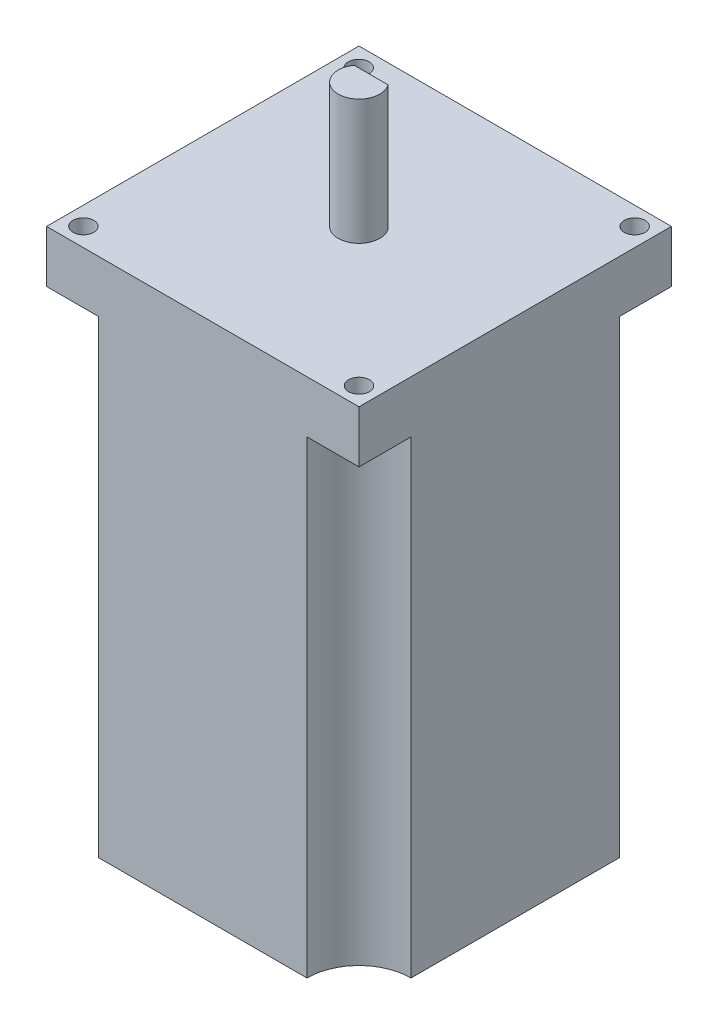
ISO-10303-21;
HEADER;
FILE_DESCRIPTION(('STEP AP214'),'2;1');
FILE_NAME('part.step','',(''),(''),'','','');
FILE_SCHEMA(('AUTOMOTIVE_DESIGN { 1 0 10303 214 1 1 1 1 }'));
ENDSEC;
DATA;
#1=APPLICATION_CONTEXT('core data for automotive mechanical design processes');
#2=APPLICATION_PROTOCOL_DEFINITION('international standard','automotive_design',2000,#1);
#3=PRODUCT_CONTEXT('',#1,'mechanical');
#4=PRODUCT('Part','Part','',(#3));
#5=PRODUCT_RELATED_PRODUCT_CATEGORY('part','',(#4));
#6=PRODUCT_DEFINITION_FORMATION('','',#4);
#7=PRODUCT_DEFINITION_CONTEXT('part definition',#1,'design');
#8=PRODUCT_DEFINITION('design','',#6,#7);
#9=PRODUCT_DEFINITION_SHAPE('','',#8);
#10=(LENGTH_UNIT() NAMED_UNIT(*) SI_UNIT(.MILLI.,.METRE.));
#11=(NAMED_UNIT(*) PLANE_ANGLE_UNIT() SI_UNIT($,.RADIAN.));
#12=(NAMED_UNIT(*) SI_UNIT($,.STERADIAN.) SOLID_ANGLE_UNIT());
#13=UNCERTAINTY_MEASURE_WITH_UNIT(LENGTH_MEASURE(1.E-05),#10,'distance_accuracy_value','');
#14=(GEOMETRIC_REPRESENTATION_CONTEXT(3) GLOBAL_UNCERTAINTY_ASSIGNED_CONTEXT((#13)) GLOBAL_UNIT_ASSIGNED_CONTEXT((#10,
#11,#12)) REPRESENTATION_CONTEXT('',''));
#15=CARTESIAN_POINT('',(0.,0.,0.));
#16=DIRECTION('',(0.,0.,1.));
#17=DIRECTION('',(1.,0.,0.));
#18=AXIS2_PLACEMENT_3D('',#15,#16,#17);
#19=CARTESIAN_POINT('',(0.,100.,0.));
#20=DIRECTION('',(0.,1.,0.));
#21=DIRECTION('',(0.,0.,1.));
#22=AXIS2_PLACEMENT_3D('',#19,#20,#21);
#23=PLANE('',#22);
#24=CARTESIAN_POINT('',(26.4644660940673,100.,-26.4644660940673));
#25=DIRECTION('',(0.,1.,0.));
#26=DIRECTION('',(0.,0.,1.));
#27=AXIS2_PLACEMENT_3D('',#24,#25,#26);
#28=CIRCLE('',#27,2.);
#29=CARTESIAN_POINT('',(26.4644660940673,100.,-24.4644660940673));
#30=VERTEX_POINT('',#29);
#31=EDGE_CURVE('E284',#30,#30,#28,.F.);
#32=ORIENTED_EDGE('',*,*,#31,.T.);
#33=EDGE_LOOP('',(#32));
#34=FACE_BOUND('',#33,.T.);
#35=CARTESIAN_POINT('',(26.4969134548636,100.,26.4969134548636));
#36=DIRECTION('',(0.,1.,0.));
#37=DIRECTION('',(0.,0.,1.));
#38=AXIS2_PLACEMENT_3D('',#35,#36,#37);
#39=CIRCLE('',#38,2.);
#40=CARTESIAN_POINT('',(26.4969134548636,100.,28.4969134548636));
#41=VERTEX_POINT('',#40);
#42=EDGE_CURVE('E278',#41,#41,#39,.F.);
#43=ORIENTED_EDGE('',*,*,#42,.T.);
#44=EDGE_LOOP('',(#43));
#45=FACE_BOUND('',#44,.T.);
#46=CARTESIAN_POINT('',(-26.4734771597201,100.,26.4554779367333));
#47=DIRECTION('',(0.,1.,0.));
#48=DIRECTION('',(0.,0.,1.));
#49=AXIS2_PLACEMENT_3D('',#46,#47,#48);
#50=CIRCLE('',#49,2.);
#51=CARTESIAN_POINT('',(-26.4734771597201,100.,28.4554779367333));
#52=VERTEX_POINT('',#51);
#53=EDGE_CURVE('E272',#52,#52,#50,.F.);
#54=ORIENTED_EDGE('',*,*,#53,.T.);
#55=EDGE_LOOP('',(#54));
#56=FACE_BOUND('',#55,.T.);
#57=CARTESIAN_POINT('',(-26.4080798581669,100.,-26.3523969664421));
#58=DIRECTION('',(0.,1.,0.));
#59=DIRECTION('',(0.,0.,1.));
#60=AXIS2_PLACEMENT_3D('',#57,#58,#59);
#61=CIRCLE('',#60,2.);
#62=CARTESIAN_POINT('',(-26.4080798581669,100.,-24.3523969664421));
#63=VERTEX_POINT('',#62);
#64=EDGE_CURVE('E266',#63,#63,#61,.F.);
#65=ORIENTED_EDGE('',*,*,#64,.T.);
#66=EDGE_LOOP('',(#65));
#67=FACE_BOUND('',#66,.T.);
#68=DIRECTION('',(0.,0.,-1.));
#69=VECTOR('',#68,1.);
#70=CARTESIAN_POINT('',(30.,100.,-30.));
#71=LINE('',#70,#69);
#72=CARTESIAN_POINT('',(30.,100.,30.));
#73=VERTEX_POINT('',#72);
#74=CARTESIAN_POINT('',(30.,100.,-30.));
#75=VERTEX_POINT('',#74);
#76=EDGE_CURVE('E143',#73,#75,#71,.T.);
#77=ORIENTED_EDGE('',*,*,#76,.T.);
#78=DIRECTION('',(-1.,0.,0.));
#79=VECTOR('',#78,1.);
#80=CARTESIAN_POINT('',(-30.,100.,-30.));
#81=LINE('',#80,#79);
#82=CARTESIAN_POINT('',(-30.,100.,-30.));
#83=VERTEX_POINT('',#82);
#84=EDGE_CURVE('E147',#75,#83,#81,.T.);
#85=ORIENTED_EDGE('',*,*,#84,.T.);
#86=DIRECTION('',(0.,0.,1.));
#87=VECTOR('',#86,1.);
#88=CARTESIAN_POINT('',(-30.,100.,-30.));
#89=LINE('',#88,#87);
#90=CARTESIAN_POINT('',(-30.,100.,30.));
#91=VERTEX_POINT('',#90);
#92=EDGE_CURVE('E248',#83,#91,#89,.T.);
#93=ORIENTED_EDGE('',*,*,#92,.T.);
#94=DIRECTION('',(1.,0.,0.));
#95=VECTOR('',#94,1.);
#96=CARTESIAN_POINT('',(-30.,100.,30.));
#97=LINE('',#96,#95);
#98=EDGE_CURVE('E167',#91,#73,#97,.T.);
#99=ORIENTED_EDGE('',*,*,#98,.T.);
#100=EDGE_LOOP('',(#77,#85,#93,#99));
#101=FACE_BOUND('',#100,.T.);
#102=DIRECTION('',(-1.,0.,0.));
#103=VECTOR('',#102,1.);
#104=CARTESIAN_POINT('',(-3.25,100.,-2.3318447632722));
#105=LINE('',#104,#103);
#106=CARTESIAN_POINT('',(3.25,100.,-2.3318447632722));
#107=VERTEX_POINT('',#106);
#108=CARTESIAN_POINT('',(-3.25,100.,-2.3318447632722));
#109=VERTEX_POINT('',#108);
#110=EDGE_CURVE('E256',#107,#109,#105,.T.);
#111=ORIENTED_EDGE('',*,*,#110,.F.);
#112=CARTESIAN_POINT('',(0.,100.,0.));
#113=DIRECTION('',(0.,1.,0.));
#114=DIRECTION('',(0.,0.,1.));
#115=AXIS2_PLACEMENT_3D('',#112,#113,#114);
#116=CIRCLE('',#115,4.);
#117=EDGE_CURVE('E52',#109,#107,#116,.T.);
#118=ORIENTED_EDGE('',*,*,#117,.F.);
#119=EDGE_LOOP('',(#111,#118));
#120=FACE_BOUND('',#119,.T.);
#121=ADVANCED_FACE('F35',(#34,#45,#56,#67,#101,#120),#23,.T.);
#122=CARTESIAN_POINT('',(30.,90.,-30.));
#123=DIRECTION('',(0.,-1.,0.));
#124=DIRECTION('',(0.,0.,-1.));
#125=AXIS2_PLACEMENT_3D('',#122,#123,#124);
#126=CYLINDRICAL_SURFACE('',#125,10.);
#127=CARTESIAN_POINT('',(30.,0.,-30.));
#128=DIRECTION('',(0.,-1.,0.));
#129=DIRECTION('',(0.,0.,1.));
#130=AXIS2_PLACEMENT_3D('',#127,#128,#129);
#131=CIRCLE('',#130,10.);
#132=CARTESIAN_POINT('',(30.,0.,-20.));
#133=VERTEX_POINT('',#132);
#134=CARTESIAN_POINT('',(20.,0.,-30.));
#135=VERTEX_POINT('',#134);
#136=EDGE_CURVE('E174',#133,#135,#131,.T.);
#137=ORIENTED_EDGE('',*,*,#136,.T.);
#138=DIRECTION('',(0.,-1.,0.));
#139=VECTOR('',#138,1.);
#140=CARTESIAN_POINT('',(20.,90.,-30.));
#141=LINE('',#140,#139);
#142=CARTESIAN_POINT('',(20.,90.,-30.));
#143=VERTEX_POINT('',#142);
#144=EDGE_CURVE('E11',#143,#135,#141,.T.);
#145=ORIENTED_EDGE('',*,*,#144,.F.);
#146=CARTESIAN_POINT('',(30.,90.,-30.));
#147=DIRECTION('',(0.,-1.,0.));
#148=DIRECTION('',(0.,0.,1.));
#149=AXIS2_PLACEMENT_3D('',#146,#147,#148);
#150=CIRCLE('',#149,10.);
#151=CARTESIAN_POINT('',(30.,90.,-20.));
#152=VERTEX_POINT('',#151);
#153=EDGE_CURVE('E299',#152,#143,#150,.T.);
#154=ORIENTED_EDGE('',*,*,#153,.F.);
#155=DIRECTION('',(0.,-1.,0.));
#156=VECTOR('',#155,1.);
#157=CARTESIAN_POINT('',(30.,90.,-20.));
#158=LINE('',#157,#156);
#159=EDGE_CURVE('E61',#152,#133,#158,.T.);
#160=ORIENTED_EDGE('',*,*,#159,.T.);
#161=EDGE_LOOP('',(#137,#145,#154,#160));
#162=FACE_BOUND('',#161,.T.);
#163=ADVANCED_FACE('F37',(#162),#126,.F.);
#164=CARTESIAN_POINT('',(-20.,90.,-30.));
#165=DIRECTION('',(0.,0.,1.));
#166=DIRECTION('',(1.,0.,0.));
#167=AXIS2_PLACEMENT_3D('',#164,#165,#166);
#168=PLANE('',#167);
#169=DIRECTION('',(-1.,0.,0.));
#170=VECTOR('',#169,1.);
#171=CARTESIAN_POINT('',(-20.,0.,-30.));
#172=LINE('',#171,#170);
#173=CARTESIAN_POINT('',(-20.,0.,-30.));
#174=VERTEX_POINT('',#173);
#175=EDGE_CURVE('E301',#135,#174,#172,.T.);
#176=ORIENTED_EDGE('',*,*,#175,.T.);
#177=DIRECTION('',(0.,-1.,0.));
#178=VECTOR('',#177,1.);
#179=CARTESIAN_POINT('',(-20.,90.,-30.));
#180=LINE('',#179,#178);
#181=CARTESIAN_POINT('',(-20.,90.,-30.));
#182=VERTEX_POINT('',#181);
#183=EDGE_CURVE('E44',#182,#174,#180,.T.);
#184=ORIENTED_EDGE('',*,*,#183,.F.);
#185=DIRECTION('',(-1.,0.,0.));
#186=VECTOR('',#185,1.);
#187=CARTESIAN_POINT('',(-30.,90.,-30.));
#188=LINE('',#187,#186);
#189=CARTESIAN_POINT('',(-30.,90.,-30.));
#190=VERTEX_POINT('',#189);
#191=EDGE_CURVE('E177',#182,#190,#188,.T.);
#192=ORIENTED_EDGE('',*,*,#191,.T.);
#193=DIRECTION('',(0.,-1.,0.));
#194=VECTOR('',#193,1.);
#195=CARTESIAN_POINT('',(-30.,100.,-30.));
#196=LINE('',#195,#194);
#197=EDGE_CURVE('E169',#83,#190,#196,.T.);
#198=ORIENTED_EDGE('',*,*,#197,.F.);
#199=ORIENTED_EDGE('',*,*,#84,.F.);
#200=DIRECTION('',(0.,-1.,0.));
#201=VECTOR('',#200,1.);
#202=CARTESIAN_POINT('',(30.,100.,-30.));
#203=LINE('',#202,#201);
#204=CARTESIAN_POINT('',(30.,90.,-30.));
#205=VERTEX_POINT('',#204);
#206=EDGE_CURVE('E172',#75,#205,#203,.T.);
#207=ORIENTED_EDGE('',*,*,#206,.T.);
#208=EDGE_CURVE('E187',#205,#143,#188,.T.);
#209=ORIENTED_EDGE('',*,*,#208,.T.);
#210=ORIENTED_EDGE('',*,*,#144,.T.);
#211=EDGE_LOOP('',(#176,#184,#192,#198,#199,#207,#209,#210));
#212=FACE_BOUND('',#211,.T.);
#213=ADVANCED_FACE('F300',(#212),#168,.F.);
#214=CARTESIAN_POINT('',(-30.,90.,-30.));
#215=DIRECTION('',(0.,-1.,0.));
#216=DIRECTION('',(0.,0.,-1.));
#217=AXIS2_PLACEMENT_3D('',#214,#215,#216);
#218=CYLINDRICAL_SURFACE('',#217,10.);
#219=CARTESIAN_POINT('',(-30.,0.,-30.));
#220=DIRECTION('',(0.,-1.,0.));
#221=DIRECTION('',(0.,0.,1.));
#222=AXIS2_PLACEMENT_3D('',#219,#220,#221);
#223=CIRCLE('',#222,10.);
#224=CARTESIAN_POINT('',(-30.,0.,-20.));
#225=VERTEX_POINT('',#224);
#226=EDGE_CURVE('E306',#174,#225,#223,.T.);
#227=ORIENTED_EDGE('',*,*,#226,.T.);
#228=DIRECTION('',(0.,-1.,0.));
#229=VECTOR('',#228,1.);
#230=CARTESIAN_POINT('',(-30.,90.,-20.));
#231=LINE('',#230,#229);
#232=CARTESIAN_POINT('',(-30.,90.,-20.));
#233=VERTEX_POINT('',#232);
#234=EDGE_CURVE('E195',#233,#225,#231,.T.);
#235=ORIENTED_EDGE('',*,*,#234,.F.);
#236=CARTESIAN_POINT('',(-30.,90.,-30.));
#237=DIRECTION('',(0.,-1.,0.));
#238=DIRECTION('',(0.,0.,1.));
#239=AXIS2_PLACEMENT_3D('',#236,#237,#238);
#240=CIRCLE('',#239,10.);
#241=EDGE_CURVE('E136',#182,#233,#240,.T.);
#242=ORIENTED_EDGE('',*,*,#241,.F.);
#243=ORIENTED_EDGE('',*,*,#183,.T.);
#244=EDGE_LOOP('',(#227,#235,#242,#243));
#245=FACE_BOUND('',#244,.T.);
#246=ADVANCED_FACE('F344',(#245),#218,.F.);
#247=CARTESIAN_POINT('',(-30.,90.,-20.));
#248=DIRECTION('',(1.,0.,0.));
#249=DIRECTION('',(0.,0.,-1.));
#250=AXIS2_PLACEMENT_3D('',#247,#248,#249);
#251=PLANE('',#250);
#252=DIRECTION('',(0.,0.,1.));
#253=VECTOR('',#252,1.);
#254=CARTESIAN_POINT('',(-30.,0.,-20.));
#255=LINE('',#254,#253);
#256=CARTESIAN_POINT('',(-30.,0.,20.));
#257=VERTEX_POINT('',#256);
#258=EDGE_CURVE('E313',#225,#257,#255,.T.);
#259=ORIENTED_EDGE('',*,*,#258,.T.);
#260=DIRECTION('',(0.,-1.,0.));
#261=VECTOR('',#260,1.);
#262=CARTESIAN_POINT('',(-30.,90.,20.));
#263=LINE('',#262,#261);
#264=CARTESIAN_POINT('',(-30.,90.,20.));
#265=VERTEX_POINT('',#264);
#266=EDGE_CURVE('E125',#265,#257,#263,.T.);
#267=ORIENTED_EDGE('',*,*,#266,.F.);
#268=DIRECTION('',(0.,0.,1.));
#269=VECTOR('',#268,1.);
#270=CARTESIAN_POINT('',(-30.,90.,-30.));
#271=LINE('',#270,#269);
#272=CARTESIAN_POINT('',(-30.,90.,30.));
#273=VERTEX_POINT('',#272);
#274=EDGE_CURVE('E134',#265,#273,#271,.T.);
#275=ORIENTED_EDGE('',*,*,#274,.T.);
#276=DIRECTION('',(0.,-1.,0.));
#277=VECTOR('',#276,1.);
#278=CARTESIAN_POINT('',(-30.,100.,30.));
#279=LINE('',#278,#277);
#280=EDGE_CURVE('E142',#91,#273,#279,.T.);
#281=ORIENTED_EDGE('',*,*,#280,.F.);
#282=ORIENTED_EDGE('',*,*,#92,.F.);
#283=ORIENTED_EDGE('',*,*,#197,.T.);
#284=EDGE_CURVE('E150',#190,#233,#271,.T.);
#285=ORIENTED_EDGE('',*,*,#284,.T.);
#286=ORIENTED_EDGE('',*,*,#234,.T.);
#287=EDGE_LOOP('',(#259,#267,#275,#281,#282,#283,#285,#286));
#288=FACE_BOUND('',#287,.T.);
#289=ADVANCED_FACE('F194',(#288),#251,.F.);
#290=CARTESIAN_POINT('',(-30.,90.,30.));
#291=DIRECTION('',(0.,-1.,0.));
#292=DIRECTION('',(0.,0.,-1.));
#293=AXIS2_PLACEMENT_3D('',#290,#291,#292);
#294=CYLINDRICAL_SURFACE('',#293,9.99999999999999);
#295=CARTESIAN_POINT('',(-30.,0.,30.));
#296=DIRECTION('',(0.,-1.,0.));
#297=DIRECTION('',(0.,0.,-1.));
#298=AXIS2_PLACEMENT_3D('',#295,#296,#297);
#299=CIRCLE('',#298,9.99999999999999);
#300=CARTESIAN_POINT('',(-20.,0.,30.));
#301=VERTEX_POINT('',#300);
#302=EDGE_CURVE('E121',#257,#301,#299,.T.);
#303=ORIENTED_EDGE('',*,*,#302,.T.);
#304=DIRECTION('',(0.,-1.,0.));
#305=VECTOR('',#304,1.);
#306=CARTESIAN_POINT('',(-20.,90.,30.));
#307=LINE('',#306,#305);
#308=CARTESIAN_POINT('',(-20.,90.,30.));
#309=VERTEX_POINT('',#308);
#310=EDGE_CURVE('E114',#309,#301,#307,.T.);
#311=ORIENTED_EDGE('',*,*,#310,.F.);
#312=CARTESIAN_POINT('',(-30.,90.,30.));
#313=DIRECTION('',(0.,-1.,0.));
#314=DIRECTION('',(0.,0.,-1.));
#315=AXIS2_PLACEMENT_3D('',#312,#313,#314);
#316=CIRCLE('',#315,9.99999999999999);
#317=EDGE_CURVE('E118',#265,#309,#316,.T.);
#318=ORIENTED_EDGE('',*,*,#317,.F.);
#319=ORIENTED_EDGE('',*,*,#266,.T.);
#320=EDGE_LOOP('',(#303,#311,#318,#319));
#321=FACE_BOUND('',#320,.T.);
#322=ADVANCED_FACE('F116',(#321),#294,.F.);
#323=CARTESIAN_POINT('',(-20.,90.,30.));
#324=DIRECTION('',(0.,0.,-1.));
#325=DIRECTION('',(-1.,0.,0.));
#326=AXIS2_PLACEMENT_3D('',#323,#324,#325);
#327=PLANE('',#326);
#328=DIRECTION('',(1.,0.,0.));
#329=VECTOR('',#328,1.);
#330=CARTESIAN_POINT('',(-20.,0.,30.));
#331=LINE('',#330,#329);
#332=CARTESIAN_POINT('',(20.,0.,30.));
#333=VERTEX_POINT('',#332);
#334=EDGE_CURVE('E316',#301,#333,#331,.T.);
#335=ORIENTED_EDGE('',*,*,#334,.T.);
#336=DIRECTION('',(0.,-1.,0.));
#337=VECTOR('',#336,1.);
#338=CARTESIAN_POINT('',(20.,90.,30.));
#339=LINE('',#338,#337);
#340=CARTESIAN_POINT('',(20.,90.,30.));
#341=VERTEX_POINT('',#340);
#342=EDGE_CURVE('E126',#341,#333,#339,.T.);
#343=ORIENTED_EDGE('',*,*,#342,.F.);
#344=DIRECTION('',(1.,0.,0.));
#345=VECTOR('',#344,1.);
#346=CARTESIAN_POINT('',(-30.,90.,30.));
#347=LINE('',#346,#345);
#348=CARTESIAN_POINT('',(30.,90.,30.));
#349=VERTEX_POINT('',#348);
#350=EDGE_CURVE('E144',#341,#349,#347,.T.);
#351=ORIENTED_EDGE('',*,*,#350,.T.);
#352=DIRECTION('',(0.,-1.,0.));
#353=VECTOR('',#352,1.);
#354=CARTESIAN_POINT('',(30.,100.,30.));
#355=LINE('',#354,#353);
#356=EDGE_CURVE('E163',#73,#349,#355,.T.);
#357=ORIENTED_EDGE('',*,*,#356,.F.);
#358=ORIENTED_EDGE('',*,*,#98,.F.);
#359=ORIENTED_EDGE('',*,*,#280,.T.);
#360=EDGE_CURVE('E132',#273,#309,#347,.T.);
#361=ORIENTED_EDGE('',*,*,#360,.T.);
#362=ORIENTED_EDGE('',*,*,#310,.T.);
#363=EDGE_LOOP('',(#335,#343,#351,#357,#358,#359,#361,#362));
#364=FACE_BOUND('',#363,.T.);
#365=ADVANCED_FACE('F139',(#364),#327,.F.);
#366=CARTESIAN_POINT('',(30.,90.,30.));
#367=DIRECTION('',(0.,-1.,0.));
#368=DIRECTION('',(0.,0.,-1.));
#369=AXIS2_PLACEMENT_3D('',#366,#367,#368);
#370=CYLINDRICAL_SURFACE('',#369,10.);
#371=CARTESIAN_POINT('',(30.,0.,30.));
#372=DIRECTION('',(0.,-1.,0.));
#373=DIRECTION('',(0.,0.,-1.));
#374=AXIS2_PLACEMENT_3D('',#371,#372,#373);
#375=CIRCLE('',#374,10.);
#376=CARTESIAN_POINT('',(30.,0.,20.));
#377=VERTEX_POINT('',#376);
#378=EDGE_CURVE('E239',#333,#377,#375,.T.);
#379=ORIENTED_EDGE('',*,*,#378,.T.);
#380=DIRECTION('',(0.,-1.,0.));
#381=VECTOR('',#380,1.);
#382=CARTESIAN_POINT('',(30.,90.,20.));
#383=LINE('',#382,#381);
#384=CARTESIAN_POINT('',(30.,90.,20.));
#385=VERTEX_POINT('',#384);
#386=EDGE_CURVE('E234',#385,#377,#383,.T.);
#387=ORIENTED_EDGE('',*,*,#386,.F.);
#388=CARTESIAN_POINT('',(30.,90.,30.));
#389=DIRECTION('',(0.,-1.,0.));
#390=DIRECTION('',(0.,0.,-1.));
#391=AXIS2_PLACEMENT_3D('',#388,#389,#390);
#392=CIRCLE('',#391,10.);
#393=EDGE_CURVE('E135',#341,#385,#392,.T.);
#394=ORIENTED_EDGE('',*,*,#393,.F.);
#395=ORIENTED_EDGE('',*,*,#342,.T.);
#396=EDGE_LOOP('',(#379,#387,#394,#395));
#397=FACE_BOUND('',#396,.T.);
#398=ADVANCED_FACE('F236',(#397),#370,.F.);
#399=CARTESIAN_POINT('',(30.,90.,-20.));
#400=DIRECTION('',(-1.,0.,0.));
#401=DIRECTION('',(0.,0.,1.));
#402=AXIS2_PLACEMENT_3D('',#399,#400,#401);
#403=PLANE('',#402);
#404=DIRECTION('',(0.,0.,-1.));
#405=VECTOR('',#404,1.);
#406=CARTESIAN_POINT('',(30.,0.,-20.));
#407=LINE('',#406,#405);
#408=EDGE_CURVE('E93',#377,#133,#407,.T.);
#409=ORIENTED_EDGE('',*,*,#408,.T.);
#410=ORIENTED_EDGE('',*,*,#159,.F.);
#411=DIRECTION('',(0.,0.,-1.));
#412=VECTOR('',#411,1.);
#413=CARTESIAN_POINT('',(30.,90.,-30.));
#414=LINE('',#413,#412);
#415=EDGE_CURVE('E154',#152,#205,#414,.T.);
#416=ORIENTED_EDGE('',*,*,#415,.T.);
#417=ORIENTED_EDGE('',*,*,#206,.F.);
#418=ORIENTED_EDGE('',*,*,#76,.F.);
#419=ORIENTED_EDGE('',*,*,#356,.T.);
#420=EDGE_CURVE('E175',#349,#385,#414,.T.);
#421=ORIENTED_EDGE('',*,*,#420,.T.);
#422=ORIENTED_EDGE('',*,*,#386,.T.);
#423=EDGE_LOOP('',(#409,#410,#416,#417,#418,#419,#421,#422));
#424=FACE_BOUND('',#423,.T.);
#425=ADVANCED_FACE('F245',(#424),#403,.F.);
#426=CARTESIAN_POINT('',(30.,0.,-30.));
#427=DIRECTION('',(0.,1.,0.));
#428=DIRECTION('',(0.,0.,1.));
#429=AXIS2_PLACEMENT_3D('',#426,#427,#428);
#430=PLANE('',#429);
#431=ORIENTED_EDGE('',*,*,#136,.F.);
#432=ORIENTED_EDGE('',*,*,#408,.F.);
#433=ORIENTED_EDGE('',*,*,#378,.F.);
#434=ORIENTED_EDGE('',*,*,#334,.F.);
#435=ORIENTED_EDGE('',*,*,#302,.F.);
#436=ORIENTED_EDGE('',*,*,#258,.F.);
#437=ORIENTED_EDGE('',*,*,#226,.F.);
#438=ORIENTED_EDGE('',*,*,#175,.F.);
#439=EDGE_LOOP('',(#431,#432,#433,#434,#435,#436,#437,#438));
#440=FACE_BOUND('',#439,.T.);
#441=ADVANCED_FACE('F295',(#440),#430,.F.);
#442=CARTESIAN_POINT('',(0.,90.,0.));
#443=DIRECTION('',(0.,1.,0.));
#444=DIRECTION('',(0.,0.,1.));
#445=AXIS2_PLACEMENT_3D('',#442,#443,#444);
#446=PLANE('',#445);
#447=CARTESIAN_POINT('',(26.4644660940673,90.,-26.4644660940673));
#448=DIRECTION('',(0.,-1.,0.));
#449=DIRECTION('',(0.,0.,-1.));
#450=AXIS2_PLACEMENT_3D('',#447,#448,#449);
#451=CIRCLE('',#450,2.);
#452=CARTESIAN_POINT('',(26.4644660940673,90.,-28.4644660940673));
#453=VERTEX_POINT('',#452);
#454=EDGE_CURVE('E281',#453,#453,#451,.T.);
#455=ORIENTED_EDGE('',*,*,#454,.F.);
#456=EDGE_LOOP('',(#455));
#457=FACE_BOUND('',#456,.T.);
#458=ORIENTED_EDGE('',*,*,#415,.F.);
#459=ORIENTED_EDGE('',*,*,#153,.T.);
#460=ORIENTED_EDGE('',*,*,#208,.F.);
#461=EDGE_LOOP('',(#458,#459,#460));
#462=FACE_BOUND('',#461,.T.);
#463=ADVANCED_FACE('F292',(#457,#462),#446,.F.);
#464=CARTESIAN_POINT('',(-26.4080798581669,90.,-26.3523969664421));
#465=DIRECTION('',(0.,-1.,0.));
#466=DIRECTION('',(0.,0.,-1.));
#467=AXIS2_PLACEMENT_3D('',#464,#465,#466);
#468=CIRCLE('',#467,2.);
#469=CARTESIAN_POINT('',(-26.4080798581669,90.,-28.3523969664421));
#470=VERTEX_POINT('',#469);
#471=EDGE_CURVE('E261',#470,#470,#468,.T.);
#472=ORIENTED_EDGE('',*,*,#471,.F.);
#473=EDGE_LOOP('',(#472));
#474=FACE_BOUND('',#473,.T.);
#475=ORIENTED_EDGE('',*,*,#191,.F.);
#476=ORIENTED_EDGE('',*,*,#241,.T.);
#477=ORIENTED_EDGE('',*,*,#284,.F.);
#478=EDGE_LOOP('',(#475,#476,#477));
#479=FACE_BOUND('',#478,.T.);
#480=ADVANCED_FACE('F203',(#474,#479),#446,.F.);
#481=CARTESIAN_POINT('',(-26.4734771597201,90.,26.4554779367333));
#482=DIRECTION('',(0.,-1.,0.));
#483=DIRECTION('',(0.,0.,-1.));
#484=AXIS2_PLACEMENT_3D('',#481,#482,#483);
#485=CIRCLE('',#484,2.);
#486=CARTESIAN_POINT('',(-26.4734771597201,90.,24.4554779367333));
#487=VERTEX_POINT('',#486);
#488=EDGE_CURVE('E269',#487,#487,#485,.T.);
#489=ORIENTED_EDGE('',*,*,#488,.F.);
#490=EDGE_LOOP('',(#489));
#491=FACE_BOUND('',#490,.T.);
#492=ORIENTED_EDGE('',*,*,#274,.F.);
#493=ORIENTED_EDGE('',*,*,#317,.T.);
#494=ORIENTED_EDGE('',*,*,#360,.F.);
#495=EDGE_LOOP('',(#492,#493,#494));
#496=FACE_BOUND('',#495,.T.);
#497=ADVANCED_FACE('F130',(#491,#496),#446,.F.);
#498=CARTESIAN_POINT('',(26.4969134548636,90.,26.4969134548636));
#499=DIRECTION('',(0.,-1.,0.));
#500=DIRECTION('',(0.,0.,-1.));
#501=AXIS2_PLACEMENT_3D('',#498,#499,#500);
#502=CIRCLE('',#501,2.);
#503=CARTESIAN_POINT('',(26.4969134548636,90.,24.4969134548636));
#504=VERTEX_POINT('',#503);
#505=EDGE_CURVE('E275',#504,#504,#502,.T.);
#506=ORIENTED_EDGE('',*,*,#505,.F.);
#507=EDGE_LOOP('',(#506));
#508=FACE_BOUND('',#507,.T.);
#509=ORIENTED_EDGE('',*,*,#350,.F.);
#510=ORIENTED_EDGE('',*,*,#393,.T.);
#511=ORIENTED_EDGE('',*,*,#420,.F.);
#512=EDGE_LOOP('',(#509,#510,#511));
#513=FACE_BOUND('',#512,.T.);
#514=ADVANCED_FACE('F243',(#508,#513),#446,.F.);
#515=CARTESIAN_POINT('',(0.,124.,0.));
#516=DIRECTION('',(0.,-1.,0.));
#517=DIRECTION('',(0.,0.,-1.));
#518=AXIS2_PLACEMENT_3D('',#515,#516,#517);
#519=CYLINDRICAL_SURFACE('',#518,4.);
#520=ORIENTED_EDGE('',*,*,#117,.T.);
#521=DIRECTION('',(0.,-1.,0.));
#522=VECTOR('',#521,1.);
#523=CARTESIAN_POINT('',(3.25,124.,-2.3318447632722));
#524=LINE('',#523,#522);
#525=CARTESIAN_POINT('',(3.25,124.,-2.3318447632722));
#526=VERTEX_POINT('',#525);
#527=EDGE_CURVE('E251',#526,#107,#524,.T.);
#528=ORIENTED_EDGE('',*,*,#527,.F.);
#529=CARTESIAN_POINT('',(0.,124.,0.));
#530=DIRECTION('',(0.,1.,0.));
#531=DIRECTION('',(0.,0.,1.));
#532=AXIS2_PLACEMENT_3D('',#529,#530,#531);
#533=CIRCLE('',#532,4.);
#534=CARTESIAN_POINT('',(-3.25,124.,-2.3318447632722));
#535=VERTEX_POINT('',#534);
#536=EDGE_CURVE('E259',#535,#526,#533,.T.);
#537=ORIENTED_EDGE('',*,*,#536,.F.);
#538=DIRECTION('',(0.,-1.,0.));
#539=VECTOR('',#538,1.);
#540=CARTESIAN_POINT('',(-3.25,124.,-2.3318447632722));
#541=LINE('',#540,#539);
#542=EDGE_CURVE('E253',#535,#109,#541,.T.);
#543=ORIENTED_EDGE('',*,*,#542,.T.);
#544=EDGE_LOOP('',(#520,#528,#537,#543));
#545=FACE_BOUND('',#544,.T.);
#546=ADVANCED_FACE('F360',(#545),#519,.T.);
#547=CARTESIAN_POINT('',(-3.25,124.,-2.3318447632722));
#548=DIRECTION('',(0.,0.,1.));
#549=DIRECTION('',(1.,0.,0.));
#550=AXIS2_PLACEMENT_3D('',#547,#548,#549);
#551=PLANE('',#550);
#552=ORIENTED_EDGE('',*,*,#110,.T.);
#553=ORIENTED_EDGE('',*,*,#542,.F.);
#554=DIRECTION('',(-1.,0.,0.));
#555=VECTOR('',#554,1.);
#556=CARTESIAN_POINT('',(-3.25,124.,-2.3318447632722));
#557=LINE('',#556,#555);
#558=EDGE_CURVE('E255',#526,#535,#557,.T.);
#559=ORIENTED_EDGE('',*,*,#558,.F.);
#560=ORIENTED_EDGE('',*,*,#527,.T.);
#561=EDGE_LOOP('',(#552,#553,#559,#560));
#562=FACE_BOUND('',#561,.T.);
#563=ADVANCED_FACE('F363',(#562),#551,.F.);
#564=CARTESIAN_POINT('',(0.,124.,0.));
#565=DIRECTION('',(0.,1.,0.));
#566=DIRECTION('',(0.,0.,1.));
#567=AXIS2_PLACEMENT_3D('',#564,#565,#566);
#568=PLANE('',#567);
#569=ORIENTED_EDGE('',*,*,#536,.T.);
#570=ORIENTED_EDGE('',*,*,#558,.T.);
#571=EDGE_LOOP('',(#569,#570));
#572=FACE_BOUND('',#571,.T.);
#573=ADVANCED_FACE('F366',(#572),#568,.T.);
#574=CARTESIAN_POINT('',(-26.4080798581669,124.001,-26.3523969664421));
#575=DIRECTION('',(0.,-1.,0.));
#576=DIRECTION('',(0.,0.,-1.));
#577=AXIS2_PLACEMENT_3D('',#574,#575,#576);
#578=CYLINDRICAL_SURFACE('',#577,2.);
#579=ORIENTED_EDGE('',*,*,#64,.F.);
#580=EDGE_LOOP('',(#579));
#581=FACE_BOUND('',#580,.T.);
#582=ORIENTED_EDGE('',*,*,#471,.T.);
#583=EDGE_LOOP('',(#582));
#584=FACE_BOUND('',#583,.T.);
#585=ADVANCED_FACE('F370',(#581,#584),#578,.F.);
#586=CARTESIAN_POINT('',(-26.4734771597201,124.001,26.4554779367333));
#587=DIRECTION('',(0.,-1.,0.));
#588=DIRECTION('',(0.,0.,-1.));
#589=AXIS2_PLACEMENT_3D('',#586,#587,#588);
#590=CYLINDRICAL_SURFACE('',#589,2.);
#591=ORIENTED_EDGE('',*,*,#53,.F.);
#592=EDGE_LOOP('',(#591));
#593=FACE_BOUND('',#592,.T.);
#594=ORIENTED_EDGE('',*,*,#488,.T.);
#595=EDGE_LOOP('',(#594));
#596=FACE_BOUND('',#595,.T.);
#597=ADVANCED_FACE('F374',(#593,#596),#590,.F.);
#598=CARTESIAN_POINT('',(26.4969134548636,124.001,26.4969134548636));
#599=DIRECTION('',(0.,-1.,0.));
#600=DIRECTION('',(0.,0.,-1.));
#601=AXIS2_PLACEMENT_3D('',#598,#599,#600);
#602=CYLINDRICAL_SURFACE('',#601,2.);
#603=ORIENTED_EDGE('',*,*,#42,.F.);
#604=EDGE_LOOP('',(#603));
#605=FACE_BOUND('',#604,.T.);
#606=ORIENTED_EDGE('',*,*,#505,.T.);
#607=EDGE_LOOP('',(#606));
#608=FACE_BOUND('',#607,.T.);
#609=ADVANCED_FACE('F378',(#605,#608),#602,.F.);
#610=CARTESIAN_POINT('',(26.4644660940673,124.001,-26.4644660940673));
#611=DIRECTION('',(0.,-1.,0.));
#612=DIRECTION('',(0.,0.,-1.));
#613=AXIS2_PLACEMENT_3D('',#610,#611,#612);
#614=CYLINDRICAL_SURFACE('',#613,2.);
#615=ORIENTED_EDGE('',*,*,#31,.F.);
#616=EDGE_LOOP('',(#615));
#617=FACE_BOUND('',#616,.T.);
#618=ORIENTED_EDGE('',*,*,#454,.T.);
#619=EDGE_LOOP('',(#618));
#620=FACE_BOUND('',#619,.T.);
#621=ADVANCED_FACE('F290',(#617,#620),#614,.F.);
#622=CLOSED_SHELL('',(#121,#163,#213,#246,#289,#322,#365,#398,#425,#441,#463,#480,#497,#514,
#546,#563,#573,#585,#597,#609,#621));
#623=MANIFOLD_SOLID_BREP('B2',#622);
#624=ADVANCED_BREP_SHAPE_REPRESENTATION('',(#18,#623),#14);
#625=SHAPE_DEFINITION_REPRESENTATION(#9,#624);
ENDSEC;
END-ISO-10303-21;
